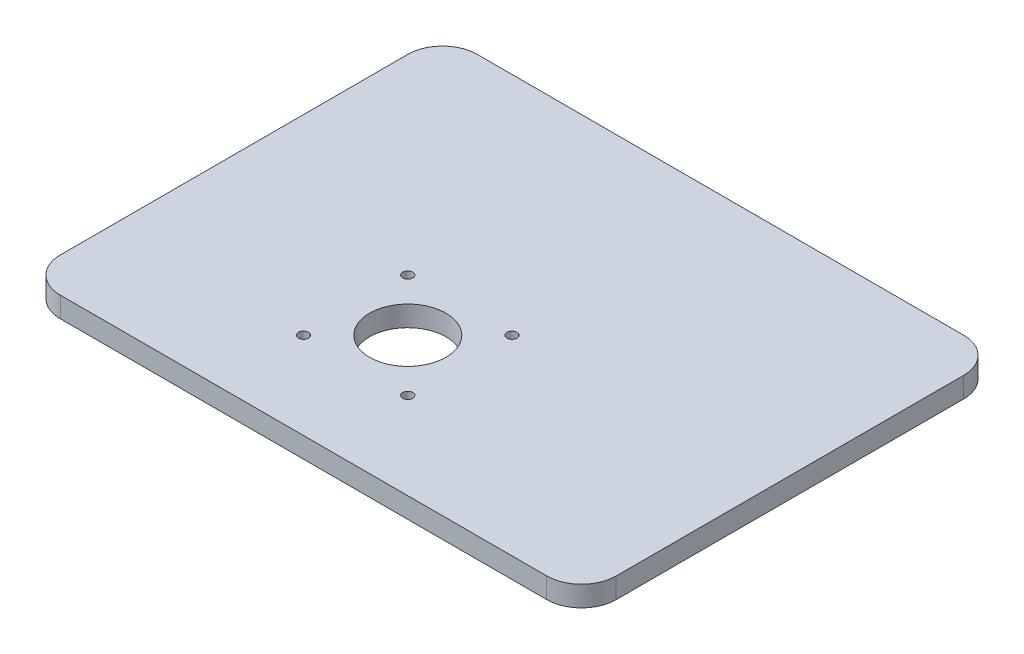
ISO-10303-21;
HEADER;
FILE_DESCRIPTION(('STEP AP214'),'2;1');
FILE_NAME('part.step','',(''),(''),'','','');
FILE_SCHEMA(('AUTOMOTIVE_DESIGN { 1 0 10303 214 1 1 1 1 }'));
ENDSEC;
DATA;
#1=APPLICATION_CONTEXT('core data for automotive mechanical design processes');
#2=APPLICATION_PROTOCOL_DEFINITION('international standard','automotive_design',2000,#1);
#3=PRODUCT_CONTEXT('',#1,'mechanical');
#4=PRODUCT('Part','Part','',(#3));
#5=PRODUCT_RELATED_PRODUCT_CATEGORY('part','',(#4));
#6=PRODUCT_DEFINITION_FORMATION('','',#4);
#7=PRODUCT_DEFINITION_CONTEXT('part definition',#1,'design');
#8=PRODUCT_DEFINITION('design','',#6,#7);
#9=PRODUCT_DEFINITION_SHAPE('','',#8);
#10=(LENGTH_UNIT() NAMED_UNIT(*) SI_UNIT(.MILLI.,.METRE.));
#11=(NAMED_UNIT(*) PLANE_ANGLE_UNIT() SI_UNIT($,.RADIAN.));
#12=(NAMED_UNIT(*) SI_UNIT($,.STERADIAN.) SOLID_ANGLE_UNIT());
#13=UNCERTAINTY_MEASURE_WITH_UNIT(LENGTH_MEASURE(1.E-05),#10,'distance_accuracy_value','');
#14=(GEOMETRIC_REPRESENTATION_CONTEXT(3) GLOBAL_UNCERTAINTY_ASSIGNED_CONTEXT((#13)) GLOBAL_UNIT_ASSIGNED_CONTEXT((#10,
#11,#12)) REPRESENTATION_CONTEXT('',''));
#15=CARTESIAN_POINT('',(0.,0.,0.));
#16=DIRECTION('',(0.,0.,1.));
#17=DIRECTION('',(1.,0.,0.));
#18=AXIS2_PLACEMENT_3D('',#15,#16,#17);
#19=CARTESIAN_POINT('',(0.,5.9,0.));
#20=DIRECTION('',(0.,1.,0.));
#21=DIRECTION('',(0.,0.,1.));
#22=AXIS2_PLACEMENT_3D('',#19,#20,#21);
#23=PLANE('',#22);
#24=CARTESIAN_POINT('',(85.,5.9,91.6703662597114));
#25=DIRECTION('',(0.,1.,0.));
#26=DIRECTION('',(0.,0.,1.));
#27=AXIS2_PLACEMENT_3D('',#24,#25,#26);
#28=CIRCLE('',#27,1.45);
#29=CARTESIAN_POINT('',(85.,5.9,93.1203662597114));
#30=VERTEX_POINT('',#29);
#31=EDGE_CURVE('E197',#30,#30,#28,.T.);
#32=ORIENTED_EDGE('',*,*,#31,.F.);
#33=EDGE_LOOP('',(#32));
#34=FACE_BOUND('',#33,.T.);
#35=CARTESIAN_POINT('',(55.,5.9,61.6703662597115));
#36=DIRECTION('',(0.,1.,0.));
#37=DIRECTION('',(0.,0.,1.));
#38=AXIS2_PLACEMENT_3D('',#35,#36,#37);
#39=CIRCLE('',#38,1.45);
#40=CARTESIAN_POINT('',(55.,5.9,63.1203662597115));
#41=VERTEX_POINT('',#40);
#42=EDGE_CURVE('E186',#41,#41,#39,.T.);
#43=ORIENTED_EDGE('',*,*,#42,.F.);
#44=EDGE_LOOP('',(#43));
#45=FACE_BOUND('',#44,.T.);
#46=DIRECTION('',(1.,0.,0.));
#47=VECTOR('',#46,1.);
#48=CARTESIAN_POINT('',(0.,5.9,116.670366259711));
#49=LINE('',#48,#47);
#50=CARTESIAN_POINT('',(10.,5.9,116.670366259711));
#51=VERTEX_POINT('',#50);
#52=CARTESIAN_POINT('',(150.,5.9,116.670366259711));
#53=VERTEX_POINT('',#52);
#54=EDGE_CURVE('E172',#51,#53,#49,.T.);
#55=ORIENTED_EDGE('',*,*,#54,.T.);
#56=CARTESIAN_POINT('',(150.,5.9,106.670366259711));
#57=DIRECTION('',(0.,1.,0.));
#58=DIRECTION('',(0.,0.,1.));
#59=AXIS2_PLACEMENT_3D('',#56,#57,#58);
#60=CIRCLE('',#59,10.);
#61=CARTESIAN_POINT('',(160.,5.9,106.670366259711));
#62=VERTEX_POINT('',#61);
#63=EDGE_CURVE('E153',#53,#62,#60,.T.);
#64=ORIENTED_EDGE('',*,*,#63,.T.);
#65=DIRECTION('',(0.,0.,-1.));
#66=VECTOR('',#65,1.);
#67=CARTESIAN_POINT('',(160.,5.9,-3.32963374028855));
#68=LINE('',#67,#66);
#69=CARTESIAN_POINT('',(160.,5.9,6.67036625971145));
#70=VERTEX_POINT('',#69);
#71=EDGE_CURVE('E123',#62,#70,#68,.T.);
#72=ORIENTED_EDGE('',*,*,#71,.T.);
#73=CARTESIAN_POINT('',(150.,5.9,6.67036625971145));
#74=DIRECTION('',(0.,1.,0.));
#75=DIRECTION('',(0.,0.,1.));
#76=AXIS2_PLACEMENT_3D('',#73,#74,#75);
#77=CIRCLE('',#76,10.);
#78=CARTESIAN_POINT('',(150.,5.9,-3.32963374028855));
#79=VERTEX_POINT('',#78);
#80=EDGE_CURVE('E59',#70,#79,#77,.T.);
#81=ORIENTED_EDGE('',*,*,#80,.T.);
#82=DIRECTION('',(-1.,0.,0.));
#83=VECTOR('',#82,1.);
#84=CARTESIAN_POINT('',(0.,5.9,-3.32963374028855));
#85=LINE('',#84,#83);
#86=CARTESIAN_POINT('',(10.,5.9,-3.32963374028855));
#87=VERTEX_POINT('',#86);
#88=EDGE_CURVE('E139',#79,#87,#85,.T.);
#89=ORIENTED_EDGE('',*,*,#88,.T.);
#90=CARTESIAN_POINT('',(10.,5.9,6.67036625971145));
#91=DIRECTION('',(0.,1.,0.));
#92=DIRECTION('',(0.,0.,1.));
#93=AXIS2_PLACEMENT_3D('',#90,#91,#92);
#94=CIRCLE('',#93,10.);
#95=CARTESIAN_POINT('',(0.,5.9,6.67036625971145));
#96=VERTEX_POINT('',#95);
#97=EDGE_CURVE('E150',#87,#96,#94,.T.);
#98=ORIENTED_EDGE('',*,*,#97,.T.);
#99=DIRECTION('',(0.,0.,1.));
#100=VECTOR('',#99,1.);
#101=CARTESIAN_POINT('',(0.,5.9,-3.32963374028855));
#102=LINE('',#101,#100);
#103=CARTESIAN_POINT('',(0.,5.9,106.670366259711));
#104=VERTEX_POINT('',#103);
#105=EDGE_CURVE('E133',#96,#104,#102,.T.);
#106=ORIENTED_EDGE('',*,*,#105,.T.);
#107=CARTESIAN_POINT('',(10.,5.9,106.670366259711));
#108=DIRECTION('',(0.,1.,0.));
#109=DIRECTION('',(0.,0.,1.));
#110=AXIS2_PLACEMENT_3D('',#107,#108,#109);
#111=CIRCLE('',#110,10.);
#112=EDGE_CURVE('E148',#104,#51,#111,.T.);
#113=ORIENTED_EDGE('',*,*,#112,.T.);
#114=EDGE_LOOP('',(#55,#64,#72,#81,#89,#98,#106,#113));
#115=FACE_BOUND('',#114,.T.);
#116=CARTESIAN_POINT('',(70.,5.9,76.6703662597115));
#117=DIRECTION('',(0.,1.,0.));
#118=DIRECTION('',(0.,0.,1.));
#119=AXIS2_PLACEMENT_3D('',#116,#117,#118);
#120=CIRCLE('',#119,11.);
#121=CARTESIAN_POINT('',(70.,5.9,87.6703662597114));
#122=VERTEX_POINT('',#121);
#123=EDGE_CURVE('E177',#122,#122,#120,.T.);
#124=ORIENTED_EDGE('',*,*,#123,.F.);
#125=EDGE_LOOP('',(#124));
#126=FACE_BOUND('',#125,.T.);
#127=CARTESIAN_POINT('',(85.,5.9,61.6703662597115));
#128=DIRECTION('',(0.,1.,0.));
#129=DIRECTION('',(0.,0.,1.));
#130=AXIS2_PLACEMENT_3D('',#127,#128,#129);
#131=CIRCLE('',#130,1.45);
#132=CARTESIAN_POINT('',(85.,5.9,63.1203662597115));
#133=VERTEX_POINT('',#132);
#134=EDGE_CURVE('E191',#133,#133,#131,.T.);
#135=ORIENTED_EDGE('',*,*,#134,.F.);
#136=EDGE_LOOP('',(#135));
#137=FACE_BOUND('',#136,.T.);
#138=CARTESIAN_POINT('',(55.,5.9,91.6703662597114));
#139=DIRECTION('',(0.,1.,0.));
#140=DIRECTION('',(0.,0.,1.));
#141=AXIS2_PLACEMENT_3D('',#138,#139,#140);
#142=CIRCLE('',#141,1.45);
#143=CARTESIAN_POINT('',(55.,5.9,93.1203662597115));
#144=VERTEX_POINT('',#143);
#145=EDGE_CURVE('E203',#144,#144,#142,.T.);
#146=ORIENTED_EDGE('',*,*,#145,.F.);
#147=EDGE_LOOP('',(#146));
#148=FACE_BOUND('',#147,.T.);
#149=ADVANCED_FACE('F37',(#34,#45,#115,#126,#137,#148),#23,.T.);
#150=CARTESIAN_POINT('',(0.,0.,0.));
#151=DIRECTION('',(0.,1.,0.));
#152=DIRECTION('',(0.,0.,1.));
#153=AXIS2_PLACEMENT_3D('',#150,#151,#152);
#154=PLANE('',#153);
#155=DIRECTION('',(0.,0.,-1.));
#156=VECTOR('',#155,1.);
#157=CARTESIAN_POINT('',(160.,0.,-3.32963374028855));
#158=LINE('',#157,#156);
#159=CARTESIAN_POINT('',(160.,0.,106.670366259711));
#160=VERTEX_POINT('',#159);
#161=CARTESIAN_POINT('',(160.,0.,6.67036625971145));
#162=VERTEX_POINT('',#161);
#163=EDGE_CURVE('E121',#160,#162,#158,.T.);
#164=ORIENTED_EDGE('',*,*,#163,.F.);
#165=CARTESIAN_POINT('',(150.,0.,106.670366259711));
#166=DIRECTION('',(0.,1.,0.));
#167=DIRECTION('',(0.,0.,1.));
#168=AXIS2_PLACEMENT_3D('',#165,#166,#167);
#169=CIRCLE('',#168,10.);
#170=CARTESIAN_POINT('',(150.,0.,116.670366259711));
#171=VERTEX_POINT('',#170);
#172=EDGE_CURVE('E104',#160,#171,#169,.F.);
#173=ORIENTED_EDGE('',*,*,#172,.T.);
#174=DIRECTION('',(1.,0.,0.));
#175=VECTOR('',#174,1.);
#176=CARTESIAN_POINT('',(0.,0.,116.670366259711));
#177=LINE('',#176,#175);
#178=CARTESIAN_POINT('',(10.,0.,116.670366259711));
#179=VERTEX_POINT('',#178);
#180=EDGE_CURVE('E131',#179,#171,#177,.T.);
#181=ORIENTED_EDGE('',*,*,#180,.F.);
#182=CARTESIAN_POINT('',(10.,0.,106.670366259711));
#183=DIRECTION('',(0.,1.,0.));
#184=DIRECTION('',(0.,0.,1.));
#185=AXIS2_PLACEMENT_3D('',#182,#183,#184);
#186=CIRCLE('',#185,10.);
#187=CARTESIAN_POINT('',(0.,0.,106.670366259711));
#188=VERTEX_POINT('',#187);
#189=EDGE_CURVE('E124',#179,#188,#186,.F.);
#190=ORIENTED_EDGE('',*,*,#189,.T.);
#191=DIRECTION('',(0.,0.,1.));
#192=VECTOR('',#191,1.);
#193=CARTESIAN_POINT('',(0.,0.,-3.32963374028855));
#194=LINE('',#193,#192);
#195=CARTESIAN_POINT('',(0.,0.,6.67036625971145));
#196=VERTEX_POINT('',#195);
#197=EDGE_CURVE('E135',#196,#188,#194,.T.);
#198=ORIENTED_EDGE('',*,*,#197,.F.);
#199=CARTESIAN_POINT('',(10.,0.,6.67036625971145));
#200=DIRECTION('',(0.,1.,0.));
#201=DIRECTION('',(0.,0.,1.));
#202=AXIS2_PLACEMENT_3D('',#199,#200,#201);
#203=CIRCLE('',#202,10.);
#204=CARTESIAN_POINT('',(10.,0.,-3.32963374028855));
#205=VERTEX_POINT('',#204);
#206=EDGE_CURVE('E142',#196,#205,#203,.F.);
#207=ORIENTED_EDGE('',*,*,#206,.T.);
#208=DIRECTION('',(-1.,0.,0.));
#209=VECTOR('',#208,1.);
#210=CARTESIAN_POINT('',(0.,0.,-3.32963374028855));
#211=LINE('',#210,#209);
#212=CARTESIAN_POINT('',(150.,0.,-3.32963374028855));
#213=VERTEX_POINT('',#212);
#214=EDGE_CURVE('E130',#213,#205,#211,.T.);
#215=ORIENTED_EDGE('',*,*,#214,.F.);
#216=CARTESIAN_POINT('',(150.,0.,6.67036625971145));
#217=DIRECTION('',(0.,1.,0.));
#218=DIRECTION('',(0.,0.,1.));
#219=AXIS2_PLACEMENT_3D('',#216,#217,#218);
#220=CIRCLE('',#219,10.);
#221=EDGE_CURVE('E115',#213,#162,#220,.F.);
#222=ORIENTED_EDGE('',*,*,#221,.T.);
#223=EDGE_LOOP('',(#164,#173,#181,#190,#198,#207,#215,#222));
#224=FACE_BOUND('',#223,.T.);
#225=CARTESIAN_POINT('',(70.,0.,76.6703662597115));
#226=DIRECTION('',(0.,1.,0.));
#227=DIRECTION('',(0.,0.,1.));
#228=AXIS2_PLACEMENT_3D('',#225,#226,#227);
#229=CIRCLE('',#228,11.);
#230=CARTESIAN_POINT('',(70.,0.,87.6703662597114));
#231=VERTEX_POINT('',#230);
#232=EDGE_CURVE('E179',#231,#231,#229,.T.);
#233=ORIENTED_EDGE('',*,*,#232,.T.);
#234=EDGE_LOOP('',(#233));
#235=FACE_BOUND('',#234,.T.);
#236=CARTESIAN_POINT('',(55.,0.,61.6703662597115));
#237=DIRECTION('',(0.,1.,0.));
#238=DIRECTION('',(0.,0.,1.));
#239=AXIS2_PLACEMENT_3D('',#236,#237,#238);
#240=CIRCLE('',#239,1.45);
#241=CARTESIAN_POINT('',(55.,0.,63.1203662597115));
#242=VERTEX_POINT('',#241);
#243=EDGE_CURVE('E188',#242,#242,#240,.T.);
#244=ORIENTED_EDGE('',*,*,#243,.T.);
#245=EDGE_LOOP('',(#244));
#246=FACE_BOUND('',#245,.T.);
#247=CARTESIAN_POINT('',(85.,0.,61.6703662597115));
#248=DIRECTION('',(0.,1.,0.));
#249=DIRECTION('',(0.,0.,1.));
#250=AXIS2_PLACEMENT_3D('',#247,#248,#249);
#251=CIRCLE('',#250,1.45);
#252=CARTESIAN_POINT('',(85.,0.,63.1203662597115));
#253=VERTEX_POINT('',#252);
#254=EDGE_CURVE('E194',#253,#253,#251,.T.);
#255=ORIENTED_EDGE('',*,*,#254,.T.);
#256=EDGE_LOOP('',(#255));
#257=FACE_BOUND('',#256,.T.);
#258=CARTESIAN_POINT('',(85.,0.,91.6703662597114));
#259=DIRECTION('',(0.,1.,0.));
#260=DIRECTION('',(0.,0.,1.));
#261=AXIS2_PLACEMENT_3D('',#258,#259,#260);
#262=CIRCLE('',#261,1.45);
#263=CARTESIAN_POINT('',(85.,0.,93.1203662597114));
#264=VERTEX_POINT('',#263);
#265=EDGE_CURVE('E200',#264,#264,#262,.T.);
#266=ORIENTED_EDGE('',*,*,#265,.T.);
#267=EDGE_LOOP('',(#266));
#268=FACE_BOUND('',#267,.T.);
#269=CARTESIAN_POINT('',(55.,0.,91.6703662597114));
#270=DIRECTION('',(0.,1.,0.));
#271=DIRECTION('',(0.,0.,1.));
#272=AXIS2_PLACEMENT_3D('',#269,#270,#271);
#273=CIRCLE('',#272,1.45);
#274=CARTESIAN_POINT('',(55.,0.,93.1203662597115));
#275=VERTEX_POINT('',#274);
#276=EDGE_CURVE('E206',#275,#275,#273,.T.);
#277=ORIENTED_EDGE('',*,*,#276,.T.);
#278=EDGE_LOOP('',(#277));
#279=FACE_BOUND('',#278,.T.);
#280=ADVANCED_FACE('F127',(#224,#235,#246,#257,#268,#279),#154,.F.);
#281=CARTESIAN_POINT('',(0.,5.9,-3.32963374028855));
#282=DIRECTION('',(1.,0.,0.));
#283=DIRECTION('',(0.,0.,-1.));
#284=AXIS2_PLACEMENT_3D('',#281,#282,#283);
#285=PLANE('',#284);
#286=ORIENTED_EDGE('',*,*,#105,.F.);
#287=DIRECTION('',(0.,-1.,0.));
#288=VECTOR('',#287,1.);
#289=CARTESIAN_POINT('',(0.,5.9,6.67036625971145));
#290=LINE('',#289,#288);
#291=EDGE_CURVE('E11',#96,#196,#290,.T.);
#292=ORIENTED_EDGE('',*,*,#291,.T.);
#293=ORIENTED_EDGE('',*,*,#197,.T.);
#294=DIRECTION('',(0.,-1.,0.));
#295=VECTOR('',#294,1.);
#296=CARTESIAN_POINT('',(0.,5.9,106.670366259711));
#297=LINE('',#296,#295);
#298=EDGE_CURVE('E45',#188,#104,#297,.F.);
#299=ORIENTED_EDGE('',*,*,#298,.T.);
#300=EDGE_LOOP('',(#286,#292,#293,#299));
#301=FACE_BOUND('',#300,.T.);
#302=ADVANCED_FACE('F163',(#301),#285,.F.);
#303=CARTESIAN_POINT('',(0.,5.9,116.670366259711));
#304=DIRECTION('',(0.,0.,-1.));
#305=DIRECTION('',(-1.,0.,0.));
#306=AXIS2_PLACEMENT_3D('',#303,#304,#305);
#307=PLANE('',#306);
#308=ORIENTED_EDGE('',*,*,#180,.T.);
#309=DIRECTION('',(0.,-1.,0.));
#310=VECTOR('',#309,1.);
#311=CARTESIAN_POINT('',(150.,5.9,116.670366259711));
#312=LINE('',#311,#310);
#313=EDGE_CURVE('E109',#171,#53,#312,.F.);
#314=ORIENTED_EDGE('',*,*,#313,.T.);
#315=ORIENTED_EDGE('',*,*,#54,.F.);
#316=DIRECTION('',(0.,-1.,0.));
#317=VECTOR('',#316,1.);
#318=CARTESIAN_POINT('',(10.,5.9,116.670366259711));
#319=LINE('',#318,#317);
#320=EDGE_CURVE('E114',#51,#179,#319,.T.);
#321=ORIENTED_EDGE('',*,*,#320,.T.);
#322=EDGE_LOOP('',(#308,#314,#315,#321));
#323=FACE_BOUND('',#322,.T.);
#324=ADVANCED_FACE('F176',(#323),#307,.F.);
#325=CARTESIAN_POINT('',(160.,5.9,-3.32963374028855));
#326=DIRECTION('',(-1.,0.,0.));
#327=DIRECTION('',(0.,0.,1.));
#328=AXIS2_PLACEMENT_3D('',#325,#326,#327);
#329=PLANE('',#328);
#330=ORIENTED_EDGE('',*,*,#71,.F.);
#331=DIRECTION('',(0.,-1.,0.));
#332=VECTOR('',#331,1.);
#333=CARTESIAN_POINT('',(160.,5.9,106.670366259711));
#334=LINE('',#333,#332);
#335=EDGE_CURVE('E108',#62,#160,#334,.T.);
#336=ORIENTED_EDGE('',*,*,#335,.T.);
#337=ORIENTED_EDGE('',*,*,#163,.T.);
#338=DIRECTION('',(0.,-1.,0.));
#339=VECTOR('',#338,1.);
#340=CARTESIAN_POINT('',(160.,5.9,6.67036625971145));
#341=LINE('',#340,#339);
#342=EDGE_CURVE('E125',#162,#70,#341,.F.);
#343=ORIENTED_EDGE('',*,*,#342,.T.);
#344=EDGE_LOOP('',(#330,#336,#337,#343));
#345=FACE_BOUND('',#344,.T.);
#346=ADVANCED_FACE('F120',(#345),#329,.F.);
#347=CARTESIAN_POINT('',(0.,5.9,-3.32963374028855));
#348=DIRECTION('',(0.,0.,1.));
#349=DIRECTION('',(1.,0.,0.));
#350=AXIS2_PLACEMENT_3D('',#347,#348,#349);
#351=PLANE('',#350);
#352=ORIENTED_EDGE('',*,*,#88,.F.);
#353=DIRECTION('',(0.,-1.,0.));
#354=VECTOR('',#353,1.);
#355=CARTESIAN_POINT('',(150.,5.9,-3.32963374028855));
#356=LINE('',#355,#354);
#357=EDGE_CURVE('E156',#79,#213,#356,.T.);
#358=ORIENTED_EDGE('',*,*,#357,.T.);
#359=ORIENTED_EDGE('',*,*,#214,.T.);
#360=DIRECTION('',(0.,-1.,0.));
#361=VECTOR('',#360,1.);
#362=CARTESIAN_POINT('',(10.,5.9,-3.32963374028855));
#363=LINE('',#362,#361);
#364=EDGE_CURVE('E52',#205,#87,#363,.F.);
#365=ORIENTED_EDGE('',*,*,#364,.T.);
#366=EDGE_LOOP('',(#352,#358,#359,#365));
#367=FACE_BOUND('',#366,.T.);
#368=ADVANCED_FACE('F228',(#367),#351,.F.);
#369=CARTESIAN_POINT('',(70.,5.9,76.6703662597115));
#370=DIRECTION('',(0.,-1.,0.));
#371=DIRECTION('',(0.,0.,-1.));
#372=AXIS2_PLACEMENT_3D('',#369,#370,#371);
#373=CYLINDRICAL_SURFACE('',#372,11.);
#374=ORIENTED_EDGE('',*,*,#123,.T.);
#375=EDGE_LOOP('',(#374));
#376=FACE_BOUND('',#375,.T.);
#377=ORIENTED_EDGE('',*,*,#232,.F.);
#378=EDGE_LOOP('',(#377));
#379=FACE_BOUND('',#378,.T.);
#380=ADVANCED_FACE('F225',(#376,#379),#373,.F.);
#381=CARTESIAN_POINT('',(55.,5.9,61.6703662597115));
#382=DIRECTION('',(0.,-1.,0.));
#383=DIRECTION('',(0.,0.,-1.));
#384=AXIS2_PLACEMENT_3D('',#381,#382,#383);
#385=CYLINDRICAL_SURFACE('',#384,1.45);
#386=ORIENTED_EDGE('',*,*,#42,.T.);
#387=EDGE_LOOP('',(#386));
#388=FACE_BOUND('',#387,.T.);
#389=ORIENTED_EDGE('',*,*,#243,.F.);
#390=EDGE_LOOP('',(#389));
#391=FACE_BOUND('',#390,.T.);
#392=ADVANCED_FACE('F330',(#388,#391),#385,.F.);
#393=CARTESIAN_POINT('',(85.,5.9,61.6703662597115));
#394=DIRECTION('',(0.,-1.,0.));
#395=DIRECTION('',(0.,0.,-1.));
#396=AXIS2_PLACEMENT_3D('',#393,#394,#395);
#397=CYLINDRICAL_SURFACE('',#396,1.45);
#398=ORIENTED_EDGE('',*,*,#134,.T.);
#399=EDGE_LOOP('',(#398));
#400=FACE_BOUND('',#399,.T.);
#401=ORIENTED_EDGE('',*,*,#254,.F.);
#402=EDGE_LOOP('',(#401));
#403=FACE_BOUND('',#402,.T.);
#404=ADVANCED_FACE('F320',(#400,#403),#397,.F.);
#405=CARTESIAN_POINT('',(85.,5.9,91.6703662597114));
#406=DIRECTION('',(0.,-1.,0.));
#407=DIRECTION('',(0.,0.,-1.));
#408=AXIS2_PLACEMENT_3D('',#405,#406,#407);
#409=CYLINDRICAL_SURFACE('',#408,1.45);
#410=ORIENTED_EDGE('',*,*,#31,.T.);
#411=EDGE_LOOP('',(#410));
#412=FACE_BOUND('',#411,.T.);
#413=ORIENTED_EDGE('',*,*,#265,.F.);
#414=EDGE_LOOP('',(#413));
#415=FACE_BOUND('',#414,.T.);
#416=ADVANCED_FACE('F311',(#412,#415),#409,.F.);
#417=CARTESIAN_POINT('',(55.,5.9,91.6703662597114));
#418=DIRECTION('',(0.,-1.,0.));
#419=DIRECTION('',(0.,0.,-1.));
#420=AXIS2_PLACEMENT_3D('',#417,#418,#419);
#421=CYLINDRICAL_SURFACE('',#420,1.45);
#422=ORIENTED_EDGE('',*,*,#145,.T.);
#423=EDGE_LOOP('',(#422));
#424=FACE_BOUND('',#423,.T.);
#425=ORIENTED_EDGE('',*,*,#276,.F.);
#426=EDGE_LOOP('',(#425));
#427=FACE_BOUND('',#426,.T.);
#428=ADVANCED_FACE('F212',(#424,#427),#421,.F.);
#429=CARTESIAN_POINT('',(150.,5.9,106.670366259711));
#430=DIRECTION('',(0.,-1.,0.));
#431=DIRECTION('',(0.,0.,-1.));
#432=AXIS2_PLACEMENT_3D('',#429,#430,#431);
#433=CYLINDRICAL_SURFACE('',#432,10.);
#434=ORIENTED_EDGE('',*,*,#63,.F.);
#435=ORIENTED_EDGE('',*,*,#313,.F.);
#436=ORIENTED_EDGE('',*,*,#172,.F.);
#437=ORIENTED_EDGE('',*,*,#335,.F.);
#438=EDGE_LOOP('',(#434,#435,#436,#437));
#439=FACE_BOUND('',#438,.T.);
#440=ADVANCED_FACE('F107',(#439),#433,.T.);
#441=CARTESIAN_POINT('',(150.,5.9,6.67036625971145));
#442=DIRECTION('',(0.,-1.,0.));
#443=DIRECTION('',(0.,0.,-1.));
#444=AXIS2_PLACEMENT_3D('',#441,#442,#443);
#445=CYLINDRICAL_SURFACE('',#444,10.);
#446=ORIENTED_EDGE('',*,*,#80,.F.);
#447=ORIENTED_EDGE('',*,*,#342,.F.);
#448=ORIENTED_EDGE('',*,*,#221,.F.);
#449=ORIENTED_EDGE('',*,*,#357,.F.);
#450=EDGE_LOOP('',(#446,#447,#448,#449));
#451=FACE_BOUND('',#450,.T.);
#452=ADVANCED_FACE('F239',(#451),#445,.T.);
#453=CARTESIAN_POINT('',(10.,5.9,6.67036625971145));
#454=DIRECTION('',(0.,-1.,0.));
#455=DIRECTION('',(0.,0.,-1.));
#456=AXIS2_PLACEMENT_3D('',#453,#454,#455);
#457=CYLINDRICAL_SURFACE('',#456,10.);
#458=ORIENTED_EDGE('',*,*,#97,.F.);
#459=ORIENTED_EDGE('',*,*,#364,.F.);
#460=ORIENTED_EDGE('',*,*,#206,.F.);
#461=ORIENTED_EDGE('',*,*,#291,.F.);
#462=EDGE_LOOP('',(#458,#459,#460,#461));
#463=FACE_BOUND('',#462,.T.);
#464=ADVANCED_FACE('F241',(#463),#457,.T.);
#465=CARTESIAN_POINT('',(10.,5.9,106.670366259711));
#466=DIRECTION('',(0.,-1.,0.));
#467=DIRECTION('',(0.,0.,-1.));
#468=AXIS2_PLACEMENT_3D('',#465,#466,#467);
#469=CYLINDRICAL_SURFACE('',#468,10.);
#470=ORIENTED_EDGE('',*,*,#112,.F.);
#471=ORIENTED_EDGE('',*,*,#298,.F.);
#472=ORIENTED_EDGE('',*,*,#189,.F.);
#473=ORIENTED_EDGE('',*,*,#320,.F.);
#474=EDGE_LOOP('',(#470,#471,#472,#473));
#475=FACE_BOUND('',#474,.T.);
#476=ADVANCED_FACE('F39',(#475),#469,.T.);
#477=CLOSED_SHELL('',(#149,#280,#302,#324,#346,#368,#380,#392,#404,#416,#428,#440,#452,#464,#476));
#478=MANIFOLD_SOLID_BREP('B2',#477);
#479=ADVANCED_BREP_SHAPE_REPRESENTATION('',(#18,#478),#14);
#480=SHAPE_DEFINITION_REPRESENTATION(#9,#479);
ENDSEC;
END-ISO-10303-21;
